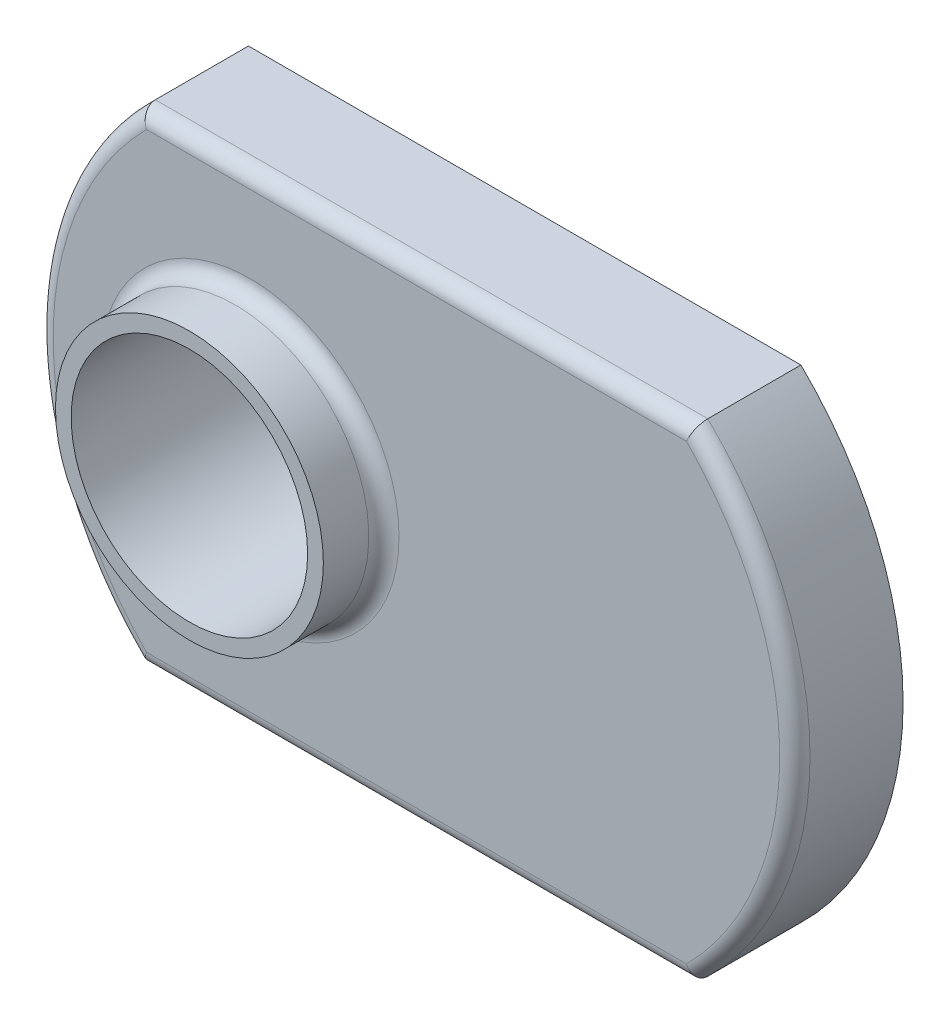
ISO-10303-21;
HEADER;
FILE_DESCRIPTION(('STEP AP214'),'2;1');
FILE_NAME('part.step','',(''),(''),'','','');
FILE_SCHEMA(('AUTOMOTIVE_DESIGN { 1 0 10303 214 1 1 1 1 }'));
ENDSEC;
DATA;
#1=APPLICATION_CONTEXT('core data for automotive mechanical design processes');
#2=APPLICATION_PROTOCOL_DEFINITION('international standard','automotive_design',2000,#1);
#3=PRODUCT_CONTEXT('',#1,'mechanical');
#4=PRODUCT('Part','Part','',(#3));
#5=PRODUCT_RELATED_PRODUCT_CATEGORY('part','',(#4));
#6=PRODUCT_DEFINITION_FORMATION('','',#4);
#7=PRODUCT_DEFINITION_CONTEXT('part definition',#1,'design');
#8=PRODUCT_DEFINITION('design','',#6,#7);
#9=PRODUCT_DEFINITION_SHAPE('','',#8);
#10=(LENGTH_UNIT() NAMED_UNIT(*) SI_UNIT(.MILLI.,.METRE.));
#11=(NAMED_UNIT(*) PLANE_ANGLE_UNIT() SI_UNIT($,.RADIAN.));
#12=(NAMED_UNIT(*) SI_UNIT($,.STERADIAN.) SOLID_ANGLE_UNIT());
#13=UNCERTAINTY_MEASURE_WITH_UNIT(LENGTH_MEASURE(1.E-05),#10,'distance_accuracy_value','');
#14=(GEOMETRIC_REPRESENTATION_CONTEXT(3) GLOBAL_UNCERTAINTY_ASSIGNED_CONTEXT((#13)) GLOBAL_UNIT_ASSIGNED_CONTEXT((#10,
#11,#12)) REPRESENTATION_CONTEXT('',''));
#15=CARTESIAN_POINT('',(0.,0.,0.));
#16=DIRECTION('',(0.,0.,1.));
#17=DIRECTION('',(1.,0.,0.));
#18=AXIS2_PLACEMENT_3D('',#15,#16,#17);
#19=CARTESIAN_POINT('',(0.,16.2052,-3.6322));
#20=DIRECTION('',(0.,0.,-1.));
#21=DIRECTION('',(-1.,0.,0.));
#22=AXIS2_PLACEMENT_3D('',#19,#20,#21);
#23=PLANE('',#22);
#24=CARTESIAN_POINT('',(11.2875718518519,8.1026,-3.6322));
#25=DIRECTION('',(0.,0.,-1.));
#26=DIRECTION('',(-1.,0.,0.));
#27=AXIS2_PLACEMENT_3D('',#24,#25,#26);
#28=CIRCLE('',#27,11.2875718518519);
#29=CARTESIAN_POINT('',(3.429,16.2052,-3.6322));
#30=VERTEX_POINT('',#29);
#31=CARTESIAN_POINT('',(3.429,0.,-3.6322));
#32=VERTEX_POINT('',#31);
#33=EDGE_CURVE('E94',#30,#32,#28,.F.);
#34=ORIENTED_EDGE('',*,*,#33,.F.);
#35=DIRECTION('',(-1.,0.,0.));
#36=VECTOR('',#35,1.);
#37=CARTESIAN_POINT('',(0.,16.2052,-3.6322));
#38=LINE('',#37,#36);
#39=CARTESIAN_POINT('',(21.971,16.2052,-3.6322));
#40=VERTEX_POINT('',#39);
#41=EDGE_CURVE('E90',#40,#30,#38,.T.);
#42=ORIENTED_EDGE('',*,*,#41,.F.);
#43=CARTESIAN_POINT('',(14.1124281481481,8.1026,-3.6322));
#44=DIRECTION('',(0.,0.,-1.));
#45=DIRECTION('',(-1.,0.,0.));
#46=AXIS2_PLACEMENT_3D('',#43,#44,#45);
#47=CIRCLE('',#46,11.2875718518519);
#48=CARTESIAN_POINT('',(21.971,0.,-3.6322));
#49=VERTEX_POINT('',#48);
#50=EDGE_CURVE('E93',#40,#49,#47,.T.);
#51=ORIENTED_EDGE('',*,*,#50,.T.);
#52=DIRECTION('',(1.,0.,0.));
#53=VECTOR('',#52,1.);
#54=CARTESIAN_POINT('',(0.,0.,-3.6322));
#55=LINE('',#54,#53);
#56=EDGE_CURVE('E106',#32,#49,#55,.T.);
#57=ORIENTED_EDGE('',*,*,#56,.F.);
#58=EDGE_LOOP('',(#34,#42,#51,#57));
#59=FACE_BOUND('',#58,.T.);
#60=CARTESIAN_POINT('',(7.112,8.1026,-3.6322));
#61=DIRECTION('',(0.,0.,-1.));
#62=DIRECTION('',(-1.,0.,0.));
#63=AXIS2_PLACEMENT_3D('',#60,#61,#62);
#64=CIRCLE('',#63,3.96875);
#65=CARTESIAN_POINT('',(3.14325,8.1026,-3.6322));
#66=VERTEX_POINT('',#65);
#67=EDGE_CURVE('E114',#66,#66,#64,.T.);
#68=ORIENTED_EDGE('',*,*,#67,.F.);
#69=EDGE_LOOP('',(#68));
#70=FACE_BOUND('',#69,.T.);
#71=ADVANCED_FACE('F30',(#59,#70),#23,.T.);
#72=CARTESIAN_POINT('',(0.,16.2052,0.));
#73=DIRECTION('',(0.,0.,-1.));
#74=DIRECTION('',(-1.,0.,0.));
#75=AXIS2_PLACEMENT_3D('',#72,#73,#74);
#76=PLANE('',#75);
#77=CARTESIAN_POINT('',(14.1124281481481,8.1026,0.));
#78=DIRECTION('',(0.,0.,-1.));
#79=DIRECTION('',(-1.,0.,0.));
#80=AXIS2_PLACEMENT_3D('',#77,#78,#79);
#81=CIRCLE('',#80,10.7795718518519);
#82=CARTESIAN_POINT('',(21.7623444973141,0.508000000000002,0.));
#83=VERTEX_POINT('',#82);
#84=CARTESIAN_POINT('',(21.7623444973141,15.6972,0.));
#85=VERTEX_POINT('',#84);
#86=EDGE_CURVE('E123',#83,#85,#81,.F.);
#87=ORIENTED_EDGE('',*,*,#86,.T.);
#88=DIRECTION('',(-1.,0.,0.));
#89=VECTOR('',#88,1.);
#90=CARTESIAN_POINT('',(3.429,15.6972,0.));
#91=LINE('',#90,#89);
#92=CARTESIAN_POINT('',(3.63765550268588,15.6972,0.));
#93=VERTEX_POINT('',#92);
#94=EDGE_CURVE('E125',#85,#93,#91,.T.);
#95=ORIENTED_EDGE('',*,*,#94,.T.);
#96=CARTESIAN_POINT('',(11.2875718518519,8.1026,0.));
#97=DIRECTION('',(0.,0.,-1.));
#98=DIRECTION('',(-1.,0.,0.));
#99=AXIS2_PLACEMENT_3D('',#96,#97,#98);
#100=CIRCLE('',#99,10.7795718518519);
#101=CARTESIAN_POINT('',(3.63765550268588,0.508000000000002,0.));
#102=VERTEX_POINT('',#101);
#103=EDGE_CURVE('E119',#93,#102,#100,.F.);
#104=ORIENTED_EDGE('',*,*,#103,.T.);
#105=DIRECTION('',(1.,0.,0.));
#106=VECTOR('',#105,1.);
#107=CARTESIAN_POINT('',(21.971,0.508000000000002,0.));
#108=LINE('',#107,#106);
#109=EDGE_CURVE('E121',#102,#83,#108,.T.);
#110=ORIENTED_EDGE('',*,*,#109,.T.);
#111=EDGE_LOOP('',(#87,#95,#104,#110));
#112=FACE_BOUND('',#111,.T.);
#113=CARTESIAN_POINT('',(7.112,8.1026,0.));
#114=DIRECTION('',(0.,0.,-1.));
#115=DIRECTION('',(-1.,0.,0.));
#116=AXIS2_PLACEMENT_3D('',#113,#114,#115);
#117=CIRCLE('',#116,5.0038);
#118=CARTESIAN_POINT('',(2.1082,8.1026,0.));
#119=VERTEX_POINT('',#118);
#120=EDGE_CURVE('E108',#119,#119,#117,.T.);
#121=ORIENTED_EDGE('',*,*,#120,.T.);
#122=EDGE_LOOP('',(#121));
#123=FACE_BOUND('',#122,.T.);
#124=ADVANCED_FACE('F204',(#112,#123),#76,.F.);
#125=CARTESIAN_POINT('',(0.,16.2052,-3.6322));
#126=DIRECTION('',(0.,1.,0.));
#127=DIRECTION('',(0.,0.,1.));
#128=AXIS2_PLACEMENT_3D('',#125,#126,#127);
#129=PLANE('',#128);
#130=DIRECTION('',(0.,0.,-1.));
#131=VECTOR('',#130,1.);
#132=CARTESIAN_POINT('',(3.429,16.2052,42.8615004012134));
#133=LINE('',#132,#131);
#134=CARTESIAN_POINT('',(3.429,16.2052,-0.507999999999995));
#135=VERTEX_POINT('',#134);
#136=EDGE_CURVE('E133',#135,#30,#133,.T.);
#137=ORIENTED_EDGE('',*,*,#136,.F.);
#138=DIRECTION('',(-1.,0.,0.));
#139=VECTOR('',#138,1.);
#140=CARTESIAN_POINT('',(21.971,16.2052,-0.508));
#141=LINE('',#140,#139);
#142=CARTESIAN_POINT('',(21.971,16.2052,-0.507999999999995));
#143=VERTEX_POINT('',#142);
#144=EDGE_CURVE('E92',#135,#143,#141,.F.);
#145=ORIENTED_EDGE('',*,*,#144,.T.);
#146=DIRECTION('',(0.,0.,-1.));
#147=VECTOR('',#146,1.);
#148=CARTESIAN_POINT('',(21.971,16.2052,42.8615004012134));
#149=LINE('',#148,#147);
#150=EDGE_CURVE('E85',#143,#40,#149,.T.);
#151=ORIENTED_EDGE('',*,*,#150,.T.);
#152=ORIENTED_EDGE('',*,*,#41,.T.);
#153=EDGE_LOOP('',(#137,#145,#151,#152));
#154=FACE_BOUND('',#153,.T.);
#155=ADVANCED_FACE('F88',(#154),#129,.T.);
#156=CARTESIAN_POINT('',(0.,0.,-3.6322));
#157=DIRECTION('',(0.,-1.,0.));
#158=DIRECTION('',(0.,0.,-1.));
#159=AXIS2_PLACEMENT_3D('',#156,#157,#158);
#160=PLANE('',#159);
#161=DIRECTION('',(0.,0.,-1.));
#162=VECTOR('',#161,1.);
#163=CARTESIAN_POINT('',(21.971,0.,42.8615004012134));
#164=LINE('',#163,#162);
#165=CARTESIAN_POINT('',(21.971,0.,-0.507999999999995));
#166=VERTEX_POINT('',#165);
#167=EDGE_CURVE('E98',#49,#166,#164,.F.);
#168=ORIENTED_EDGE('',*,*,#167,.T.);
#169=DIRECTION('',(1.,0.,0.));
#170=VECTOR('',#169,1.);
#171=CARTESIAN_POINT('',(3.429,0.,-0.508));
#172=LINE('',#171,#170);
#173=CARTESIAN_POINT('',(3.429,0.,-0.507999999999995));
#174=VERTEX_POINT('',#173);
#175=EDGE_CURVE('E45',#166,#174,#172,.F.);
#176=ORIENTED_EDGE('',*,*,#175,.T.);
#177=DIRECTION('',(0.,0.,-1.));
#178=VECTOR('',#177,1.);
#179=CARTESIAN_POINT('',(3.429,0.,42.8615004012134));
#180=LINE('',#179,#178);
#181=EDGE_CURVE('E134',#174,#32,#180,.T.);
#182=ORIENTED_EDGE('',*,*,#181,.T.);
#183=ORIENTED_EDGE('',*,*,#56,.T.);
#184=EDGE_LOOP('',(#168,#176,#182,#183));
#185=FACE_BOUND('',#184,.T.);
#186=ADVANCED_FACE('F32',(#185),#160,.T.);
#187=CARTESIAN_POINT('',(7.112,8.1026,2.032));
#188=DIRECTION('',(0.,0.,-1.));
#189=DIRECTION('',(-1.,0.,0.));
#190=AXIS2_PLACEMENT_3D('',#187,#188,#189);
#191=CYLINDRICAL_SURFACE('',#190,4.4958);
#192=CARTESIAN_POINT('',(7.112,8.1026,0.508));
#193=DIRECTION('',(0.,0.,-1.));
#194=DIRECTION('',(-1.,0.,0.));
#195=AXIS2_PLACEMENT_3D('',#192,#193,#194);
#196=CIRCLE('',#195,4.4958);
#197=CARTESIAN_POINT('',(2.6162,8.1026,0.508));
#198=VERTEX_POINT('',#197);
#199=EDGE_CURVE('E11',#198,#198,#196,.F.);
#200=ORIENTED_EDGE('',*,*,#199,.T.);
#201=EDGE_LOOP('',(#200));
#202=FACE_BOUND('',#201,.T.);
#203=CARTESIAN_POINT('',(7.112,8.1026,2.032));
#204=DIRECTION('',(0.,0.,1.));
#205=DIRECTION('',(1.,0.,0.));
#206=AXIS2_PLACEMENT_3D('',#203,#204,#205);
#207=CIRCLE('',#206,4.4958);
#208=CARTESIAN_POINT('',(11.6078,8.1026,2.032));
#209=VERTEX_POINT('',#208);
#210=EDGE_CURVE('E110',#209,#209,#207,.T.);
#211=ORIENTED_EDGE('',*,*,#210,.F.);
#212=EDGE_LOOP('',(#211));
#213=FACE_BOUND('',#212,.T.);
#214=ADVANCED_FACE('F199',(#202,#213),#191,.T.);
#215=CARTESIAN_POINT('',(7.112,8.1026,2.032));
#216=DIRECTION('',(0.,0.,1.));
#217=DIRECTION('',(1.,0.,0.));
#218=AXIS2_PLACEMENT_3D('',#215,#216,#217);
#219=PLANE('',#218);
#220=CARTESIAN_POINT('',(7.112,8.1026,2.032));
#221=DIRECTION('',(0.,0.,1.));
#222=DIRECTION('',(1.,0.,0.));
#223=AXIS2_PLACEMENT_3D('',#220,#221,#222);
#224=CIRCLE('',#223,3.96875);
#225=CARTESIAN_POINT('',(11.08075,8.1026,2.032));
#226=VERTEX_POINT('',#225);
#227=EDGE_CURVE('E101',#226,#226,#224,.T.);
#228=ORIENTED_EDGE('',*,*,#227,.F.);
#229=EDGE_LOOP('',(#228));
#230=FACE_BOUND('',#229,.T.);
#231=ORIENTED_EDGE('',*,*,#210,.T.);
#232=EDGE_LOOP('',(#231));
#233=FACE_BOUND('',#232,.T.);
#234=ADVANCED_FACE('F195',(#230,#233),#219,.T.);
#235=CARTESIAN_POINT('',(7.112,8.1026,2.032));
#236=DIRECTION('',(0.,0.,1.));
#237=DIRECTION('',(1.,0.,0.));
#238=AXIS2_PLACEMENT_3D('',#235,#236,#237);
#239=CYLINDRICAL_SURFACE('',#238,3.96875);
#240=ORIENTED_EDGE('',*,*,#67,.T.);
#241=EDGE_LOOP('',(#240));
#242=FACE_BOUND('',#241,.T.);
#243=ORIENTED_EDGE('',*,*,#227,.T.);
#244=EDGE_LOOP('',(#243));
#245=FACE_BOUND('',#244,.T.);
#246=ADVANCED_FACE('F192',(#242,#245),#239,.F.);
#247=CARTESIAN_POINT('',(14.1124281481481,8.1026,42.8615004012134));
#248=DIRECTION('',(0.,0.,-1.));
#249=DIRECTION('',(-1.,0.,0.));
#250=AXIS2_PLACEMENT_3D('',#247,#248,#249);
#251=CYLINDRICAL_SURFACE('',#250,11.2875718518519);
#252=ORIENTED_EDGE('',*,*,#150,.F.);
#253=CARTESIAN_POINT('',(14.1124281481481,8.1026,-0.508000000000002));
#254=DIRECTION('',(0.,0.,-1.));
#255=DIRECTION('',(-1.,0.,0.));
#256=AXIS2_PLACEMENT_3D('',#253,#254,#255);
#257=CIRCLE('',#256,11.2875718518519);
#258=EDGE_CURVE('E53',#143,#166,#257,.T.);
#259=ORIENTED_EDGE('',*,*,#258,.T.);
#260=ORIENTED_EDGE('',*,*,#167,.F.);
#261=ORIENTED_EDGE('',*,*,#50,.F.);
#262=EDGE_LOOP('',(#252,#259,#260,#261));
#263=FACE_BOUND('',#262,.T.);
#264=ADVANCED_FACE('F97',(#263),#251,.T.);
#265=CARTESIAN_POINT('',(11.2875718518519,8.1026,42.8615004012134));
#266=DIRECTION('',(0.,0.,-1.));
#267=DIRECTION('',(-1.,0.,0.));
#268=AXIS2_PLACEMENT_3D('',#265,#266,#267);
#269=CYLINDRICAL_SURFACE('',#268,11.2875718518519);
#270=ORIENTED_EDGE('',*,*,#181,.F.);
#271=CARTESIAN_POINT('',(11.2875718518519,8.1026,-0.508000000000002));
#272=DIRECTION('',(0.,0.,-1.));
#273=DIRECTION('',(-1.,0.,0.));
#274=AXIS2_PLACEMENT_3D('',#271,#272,#273);
#275=CIRCLE('',#274,11.2875718518519);
#276=EDGE_CURVE('E38',#174,#135,#275,.T.);
#277=ORIENTED_EDGE('',*,*,#276,.T.);
#278=ORIENTED_EDGE('',*,*,#136,.T.);
#279=ORIENTED_EDGE('',*,*,#33,.T.);
#280=EDGE_LOOP('',(#270,#277,#278,#279));
#281=FACE_BOUND('',#280,.T.);
#282=ADVANCED_FACE('F132',(#281),#269,.T.);
#283=CARTESIAN_POINT('',(0.,0.508000000000002,-0.508));
#284=DIRECTION('',(-1.,0.,0.));
#285=DIRECTION('',(0.,0.,1.));
#286=AXIS2_PLACEMENT_3D('',#283,#284,#285);
#287=CYLINDRICAL_SURFACE('',#286,0.508);
#288=CARTESIAN_POINT('',(3.429,0.,-0.507999999999995));
#289=CARTESIAN_POINT('',(3.42898831408873,-3.02343132654079E-05,-0.480934929983784));
#290=CARTESIAN_POINT('',(3.42987577116847,0.00216086007702355,-0.453889000468113));
#291=CARTESIAN_POINT('',(3.43335740954221,0.0107492954829233,-0.400658792363404));
#292=CARTESIAN_POINT('',(3.43594696420116,0.0171352340603573,-0.374472379461493));
#293=CARTESIAN_POINT('',(3.44274134413607,0.0338773223076329,-0.323635763879901));
#294=CARTESIAN_POINT('',(3.44694579866978,0.0442325607204053,-0.298985210112334));
#295=CARTESIAN_POINT('',(3.45681709724883,0.0685180262978959,-0.25183042009043));
#296=CARTESIAN_POINT('',(3.46248444429352,0.0824494830964695,-0.229326925730963));
#297=CARTESIAN_POINT('',(3.47528598456966,0.113875901195409,-0.186348043574764));
#298=CARTESIAN_POINT('',(3.48245873014562,0.131464376187394,-0.165952699341788));
#299=CARTESIAN_POINT('',(3.49794194273445,0.16936999407787,-0.128386630849486));
#300=CARTESIAN_POINT('',(3.50625278001051,0.18968802496053,-0.111216960350431));
#301=CARTESIAN_POINT('',(3.52439660201551,0.233965863636031,-0.0793222945148613));
#302=CARTESIAN_POINT('',(3.53429522356558,0.258080613690416,-0.064850019415531));
#303=CARTESIAN_POINT('',(3.55486750608426,0.308093893455235,-0.0401543570889611));
#304=CARTESIAN_POINT('',(3.56554140291015,0.333992965874879,-0.0299322692841549));
#305=CARTESIAN_POINT('',(3.5860563944548,0.38366169651262,-0.0148534143694712));
#306=CARTESIAN_POINT('',(3.59584002476985,0.407305197961299,-0.00949390641682595));
#307=CARTESIAN_POINT('',(3.61561193452468,0.454993018299731,-0.00219948352200265));
#308=CARTESIAN_POINT('',(3.62559977654523,0.479036463353435,-0.000257894868614071));
#309=CARTESIAN_POINT('',(3.63628448235962,0.504706755631485,-7.98828955047341E-06));
#310=CARTESIAN_POINT('',(3.6369699818245,0.5063534638078,1.90879874667295E-08));
#311=CARTESIAN_POINT('',(3.63765550268588,0.508000000000002,0.));
#312=B_SPLINE_CURVE_WITH_KNOTS('',3,(#288,#289,#290,#291,#292,#293,#294,#295,#296,#297,#298,
#299,#300,#301,#302,#303,#304,#305,#306,#307,#308,#309,#310,#311),.UNSPECIFIED.,.F.,.F.,(4,2,2,
2,2,2,2,2,2,2,2,4),(0.,0.0810625141558323,0.161905590691538,0.242730118680012,0.323582474389546,
0.406835152389662,0.490114980189399,0.579180713389819,0.668273656935,0.746487412321688,
0.824548280129319,0.829899325590328),.UNSPECIFIED.);
#313=EDGE_CURVE('E150',#174,#102,#312,.T.);
#314=ORIENTED_EDGE('',*,*,#313,.F.);
#315=ORIENTED_EDGE('',*,*,#175,.F.);
#316=CARTESIAN_POINT('',(21.971,0.,-0.507999999999995));
#317=CARTESIAN_POINT('',(21.9710116859113,-3.02343132652233E-05,-0.480934929983784));
#318=CARTESIAN_POINT('',(21.9701242288315,0.0021608600770237,-0.453889000468113));
#319=CARTESIAN_POINT('',(21.9666425904578,0.0107492954829232,-0.400658792363405));
#320=CARTESIAN_POINT('',(21.9640530357988,0.0171352340603572,-0.374472379461494));
#321=CARTESIAN_POINT('',(21.9572586558639,0.0338773223076327,-0.323635763879901));
#322=CARTESIAN_POINT('',(21.9530542013302,0.0442325607204051,-0.298985210112334));
#323=CARTESIAN_POINT('',(21.9431829027512,0.0685180262978957,-0.25183042009043));
#324=CARTESIAN_POINT('',(21.9375155557065,0.0824494830964691,-0.229326925730963));
#325=CARTESIAN_POINT('',(21.9247140154303,0.113875901195409,-0.186348043574764));
#326=CARTESIAN_POINT('',(21.9175412698544,0.131464376187394,-0.165952699341788));
#327=CARTESIAN_POINT('',(21.9020580572655,0.16936999407787,-0.128386630849486));
#328=CARTESIAN_POINT('',(21.8937472199895,0.189688024960529,-0.111216960350432));
#329=CARTESIAN_POINT('',(21.8756033979845,0.233965863636029,-0.0793222945148624));
#330=CARTESIAN_POINT('',(21.8657047764344,0.258080613690414,-0.0648500194155324));
#331=CARTESIAN_POINT('',(21.8451324939157,0.308093893455233,-0.0401543570889621));
#332=CARTESIAN_POINT('',(21.8344585970898,0.333992965874878,-0.0299322692841556));
#333=CARTESIAN_POINT('',(21.8139436055452,0.383661696512619,-0.0148534143694715));
#334=CARTESIAN_POINT('',(21.8041599752301,0.407305197961297,-0.00949390641682631));
#335=CARTESIAN_POINT('',(21.7843880654753,0.454993018299729,-0.00219948352200298));
#336=CARTESIAN_POINT('',(21.7744002234548,0.479036463353434,-0.000257894868614442));
#337=CARTESIAN_POINT('',(21.7637155176404,0.504706755631485,-7.98828955052097E-06));
#338=CARTESIAN_POINT('',(21.7630300181755,0.5063534638078,1.90879874416342E-08));
#339=CARTESIAN_POINT('',(21.7623444973141,0.508000000000002,0.));
#340=B_SPLINE_CURVE_WITH_KNOTS('',3,(#316,#317,#318,#319,#320,#321,#322,#323,#324,#325,#326,
#327,#328,#329,#330,#331,#332,#333,#334,#335,#336,#337,#338,#339),.UNSPECIFIED.,.F.,.F.,(4,2,2,
2,2,2,2,2,2,2,2,4),(0.,0.0810625141558318,0.161905590691538,0.242730118680011,0.323582474389545,
0.406835152389661,0.490114980189398,0.579180713389816,0.668273656934998,0.746487412321686,
0.824548280129319,0.829899325590328),.UNSPECIFIED.);
#341=EDGE_CURVE('E139',#83,#166,#340,.F.);
#342=ORIENTED_EDGE('',*,*,#341,.F.);
#343=ORIENTED_EDGE('',*,*,#109,.F.);
#344=EDGE_LOOP('',(#314,#315,#342,#343));
#345=FACE_BOUND('',#344,.T.);
#346=ADVANCED_FACE('F182',(#345),#287,.T.);
#347=CARTESIAN_POINT('',(14.1124281481481,8.1026,-0.508000000000002));
#348=DIRECTION('',(0.,0.,-1.));
#349=DIRECTION('',(-1.,0.,0.));
#350=AXIS2_PLACEMENT_3D('',#347,#348,#349);
#351=TOROIDAL_SURFACE('',#350,10.7795718518519,0.508);
#352=ORIENTED_EDGE('',*,*,#341,.T.);
#353=ORIENTED_EDGE('',*,*,#258,.F.);
#354=CARTESIAN_POINT('',(21.971,16.2052,-0.507999999999995));
#355=CARTESIAN_POINT('',(21.9710116859113,16.2052302343133,-0.480934929983784));
#356=CARTESIAN_POINT('',(21.9701242288315,16.203039139923,-0.453889000468113));
#357=CARTESIAN_POINT('',(21.9666425904578,16.1944507045171,-0.400658792363405));
#358=CARTESIAN_POINT('',(21.9640530357988,16.1880647659396,-0.374472379461494));
#359=CARTESIAN_POINT('',(21.9572586558639,16.1713226776924,-0.323635763879901));
#360=CARTESIAN_POINT('',(21.9530542013302,16.1609674392796,-0.298985210112334));
#361=CARTESIAN_POINT('',(21.9431829027512,16.1366819737021,-0.25183042009043));
#362=CARTESIAN_POINT('',(21.9375155557065,16.1227505169035,-0.229326925730963));
#363=CARTESIAN_POINT('',(21.9247140154303,16.0913240988046,-0.186348043574766));
#364=CARTESIAN_POINT('',(21.9175412698544,16.0737356238126,-0.165952699341791));
#365=CARTESIAN_POINT('',(21.9020580572656,16.0358300059221,-0.128386630849489));
#366=CARTESIAN_POINT('',(21.8937472199895,16.0155119750395,-0.111216960350434));
#367=CARTESIAN_POINT('',(21.8756033979845,15.971234136364,-0.079322294514863));
#368=CARTESIAN_POINT('',(21.8657047764344,15.9471193863096,-0.0648500194155332));
#369=CARTESIAN_POINT('',(21.8451324939157,15.8971061065448,-0.0401543570889628));
#370=CARTESIAN_POINT('',(21.8344585970899,15.8712070341251,-0.0299322692841559));
#371=CARTESIAN_POINT('',(21.8139436055452,15.8215383034874,-0.0148534143694715));
#372=CARTESIAN_POINT('',(21.8041599752301,15.7978948020387,-0.0094939064168262));
#373=CARTESIAN_POINT('',(21.7843880654753,15.7502069817003,-0.00219948352200249));
#374=CARTESIAN_POINT('',(21.7744002234548,15.7261635366466,-0.000257894868613813));
#375=CARTESIAN_POINT('',(21.7637155176404,15.7004932443685,-7.98828955045074E-06));
#376=CARTESIAN_POINT('',(21.7630300181755,15.6988465361922,1.90879874735701E-08));
#377=CARTESIAN_POINT('',(21.7623444973141,15.6972,0.));
#378=B_SPLINE_CURVE_WITH_KNOTS('',3,(#354,#355,#356,#357,#358,#359,#360,#361,#362,#363,#364,
#365,#366,#367,#368,#369,#370,#371,#372,#373,#374,#375,#376,#377),.UNSPECIFIED.,.F.,.F.,(4,2,2,
2,2,2,2,2,2,2,2,4),(0.,0.0810625141558324,0.161905590691538,0.242730118680011,0.323582474389544,
0.406835152389658,0.490114980189395,0.579180713389814,0.668273656934999,0.746487412321687,
0.824548280129323,0.829899325590328),.UNSPECIFIED.);
#379=EDGE_CURVE('E147',#85,#143,#378,.F.);
#380=ORIENTED_EDGE('',*,*,#379,.F.);
#381=ORIENTED_EDGE('',*,*,#86,.F.);
#382=EDGE_LOOP('',(#352,#353,#380,#381));
#383=FACE_BOUND('',#382,.T.);
#384=ADVANCED_FACE('F168',(#383),#351,.T.);
#385=CARTESIAN_POINT('',(11.2875718518519,8.1026,-0.508000000000002));
#386=DIRECTION('',(0.,0.,-1.));
#387=DIRECTION('',(-1.,0.,0.));
#388=AXIS2_PLACEMENT_3D('',#385,#386,#387);
#389=TOROIDAL_SURFACE('',#388,10.7795718518519,0.508);
#390=ORIENTED_EDGE('',*,*,#313,.T.);
#391=ORIENTED_EDGE('',*,*,#103,.F.);
#392=CARTESIAN_POINT('',(3.429,16.2052,-0.507999999999995));
#393=CARTESIAN_POINT('',(3.42898831408873,16.2052302343133,-0.480934929983784));
#394=CARTESIAN_POINT('',(3.42987577116847,16.203039139923,-0.453889000468113));
#395=CARTESIAN_POINT('',(3.4333574095422,16.1944507045171,-0.400658792363404));
#396=CARTESIAN_POINT('',(3.43594696420116,16.1880647659396,-0.374472379461494));
#397=CARTESIAN_POINT('',(3.44274134413607,16.1713226776924,-0.323635763879901));
#398=CARTESIAN_POINT('',(3.44694579866977,16.1609674392796,-0.298985210112334));
#399=CARTESIAN_POINT('',(3.45681709724882,16.1366819737021,-0.25183042009043));
#400=CARTESIAN_POINT('',(3.46248444429352,16.1227505169035,-0.229326925730964));
#401=CARTESIAN_POINT('',(3.47528598456966,16.0913240988046,-0.186348043574765));
#402=CARTESIAN_POINT('',(3.48245873014562,16.0737356238126,-0.165952699341789));
#403=CARTESIAN_POINT('',(3.49794194273445,16.0358300059221,-0.128386630849487));
#404=CARTESIAN_POINT('',(3.50625278001051,16.0155119750395,-0.111216960350432));
#405=CARTESIAN_POINT('',(3.52439660201551,15.971234136364,-0.0793222945148627));
#406=CARTESIAN_POINT('',(3.53429522356558,15.9471193863096,-0.0648500194155328));
#407=CARTESIAN_POINT('',(3.55486750608425,15.8971061065448,-0.0401543570889625));
#408=CARTESIAN_POINT('',(3.56554140291014,15.8712070341251,-0.0299322692841558));
#409=CARTESIAN_POINT('',(3.5860563944548,15.8215383034874,-0.0148534143694712));
#410=CARTESIAN_POINT('',(3.59584002476985,15.7978948020387,-0.00949390641682582));
#411=CARTESIAN_POINT('',(3.61561193452467,15.7502069817003,-0.00219948352200252));
#412=CARTESIAN_POINT('',(3.62559977654522,15.7261635366466,-0.000257894868613955));
#413=CARTESIAN_POINT('',(3.63628448235962,15.7004932443685,-7.98828955046852E-06));
#414=CARTESIAN_POINT('',(3.6369699818245,15.6988465361922,1.90879874647464E-08));
#415=CARTESIAN_POINT('',(3.63765550268588,15.6972,0.));
#416=B_SPLINE_CURVE_WITH_KNOTS('',3,(#392,#393,#394,#395,#396,#397,#398,#399,#400,#401,#402,
#403,#404,#405,#406,#407,#408,#409,#410,#411,#412,#413,#414,#415),.UNSPECIFIED.,.F.,.F.,(4,2,2,
2,2,2,2,2,2,2,2,4),(0.,0.0810625141558323,0.161905590691538,0.242730118680011,0.323582474389544,
0.40683515238966,0.490114980189399,0.579180713389817,0.668273656934998,0.74648741232169,
0.824548280129322,0.829899325590328),.UNSPECIFIED.);
#417=EDGE_CURVE('E144',#135,#93,#416,.T.);
#418=ORIENTED_EDGE('',*,*,#417,.F.);
#419=ORIENTED_EDGE('',*,*,#276,.F.);
#420=EDGE_LOOP('',(#390,#391,#418,#419));
#421=FACE_BOUND('',#420,.T.);
#422=ADVANCED_FACE('F148',(#421),#389,.T.);
#423=CARTESIAN_POINT('',(0.,15.6972,-0.508));
#424=DIRECTION('',(1.,0.,0.));
#425=DIRECTION('',(0.,0.,-1.));
#426=AXIS2_PLACEMENT_3D('',#423,#424,#425);
#427=CYLINDRICAL_SURFACE('',#426,0.508);
#428=ORIENTED_EDGE('',*,*,#379,.T.);
#429=ORIENTED_EDGE('',*,*,#144,.F.);
#430=ORIENTED_EDGE('',*,*,#417,.T.);
#431=ORIENTED_EDGE('',*,*,#94,.F.);
#432=EDGE_LOOP('',(#428,#429,#430,#431));
#433=FACE_BOUND('',#432,.T.);
#434=ADVANCED_FACE('F142',(#433),#427,.T.);
#435=CARTESIAN_POINT('',(7.112,8.1026,0.508));
#436=DIRECTION('',(0.,0.,-1.));
#437=DIRECTION('',(-1.,0.,0.));
#438=AXIS2_PLACEMENT_3D('',#435,#436,#437);
#439=TOROIDAL_SURFACE('',#438,5.0038,0.508);
#440=ORIENTED_EDGE('',*,*,#120,.F.);
#441=EDGE_LOOP('',(#440));
#442=FACE_BOUND('',#441,.T.);
#443=ORIENTED_EDGE('',*,*,#199,.F.);
#444=EDGE_LOOP('',(#443));
#445=FACE_BOUND('',#444,.T.);
#446=ADVANCED_FACE('F223',(#442,#445),#439,.F.);
#447=CLOSED_SHELL('',(#71,#124,#155,#186,#214,#234,#246,#264,#282,#346,#384,#422,#434,#446));
#448=MANIFOLD_SOLID_BREP('B2',#447);
#449=ADVANCED_BREP_SHAPE_REPRESENTATION('',(#18,#448),#14);
#450=SHAPE_DEFINITION_REPRESENTATION(#9,#449);
ENDSEC;
END-ISO-10303-21;
